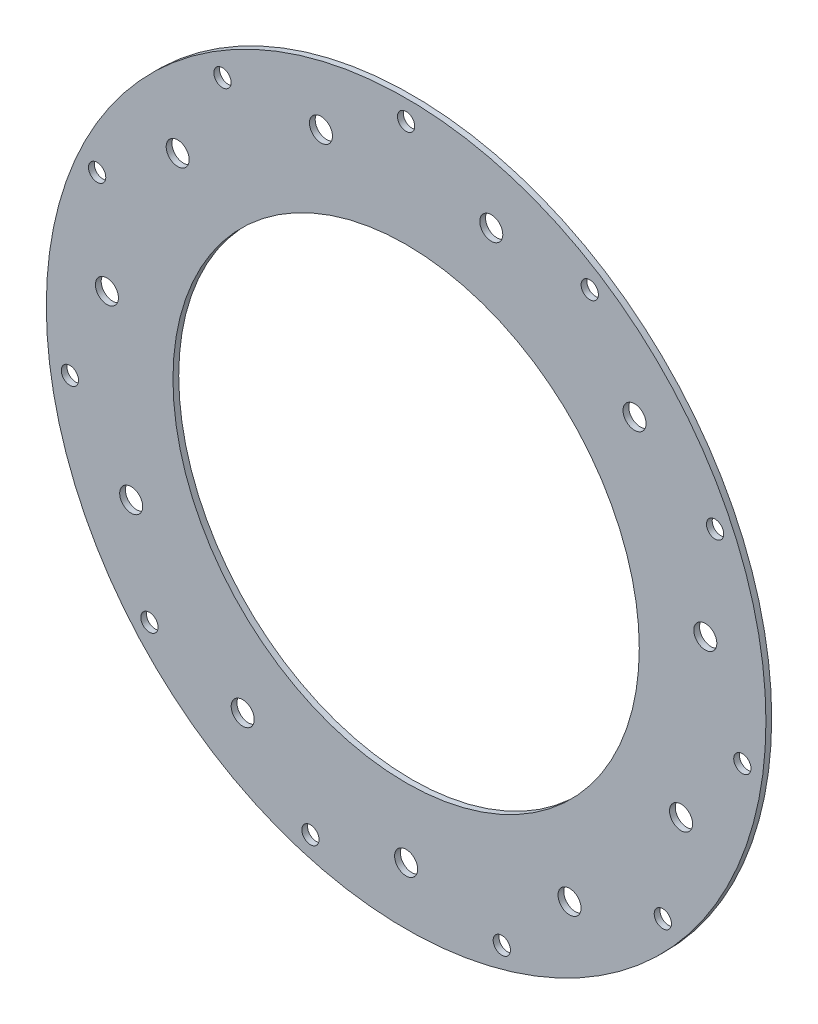
ISO-10303-21;
HEADER;
FILE_DESCRIPTION(('STEP AP214'),'2;1');
FILE_NAME('part.step','',(''),(''),'','','');
FILE_SCHEMA(('AUTOMOTIVE_DESIGN { 1 0 10303 214 1 1 1 1 }'));
ENDSEC;
DATA;
#1=APPLICATION_CONTEXT('core data for automotive mechanical design processes');
#2=APPLICATION_PROTOCOL_DEFINITION('international standard','automotive_design',2000,#1);
#3=PRODUCT_CONTEXT('',#1,'mechanical');
#4=PRODUCT('Part','Part','',(#3));
#5=PRODUCT_RELATED_PRODUCT_CATEGORY('part','',(#4));
#6=PRODUCT_DEFINITION_FORMATION('','',#4);
#7=PRODUCT_DEFINITION_CONTEXT('part definition',#1,'design');
#8=PRODUCT_DEFINITION('design','',#6,#7);
#9=PRODUCT_DEFINITION_SHAPE('','',#8);
#10=(LENGTH_UNIT() NAMED_UNIT(*) SI_UNIT(.MILLI.,.METRE.));
#11=(NAMED_UNIT(*) PLANE_ANGLE_UNIT() SI_UNIT($,.RADIAN.));
#12=(NAMED_UNIT(*) SI_UNIT($,.STERADIAN.) SOLID_ANGLE_UNIT());
#13=UNCERTAINTY_MEASURE_WITH_UNIT(LENGTH_MEASURE(1.E-05),#10,'distance_accuracy_value','');
#14=(GEOMETRIC_REPRESENTATION_CONTEXT(3) GLOBAL_UNCERTAINTY_ASSIGNED_CONTEXT((#13)) GLOBAL_UNIT_ASSIGNED_CONTEXT((#10,
#11,#12)) REPRESENTATION_CONTEXT('',''));
#15=CARTESIAN_POINT('',(0.,0.,0.));
#16=DIRECTION('',(0.,0.,1.));
#17=DIRECTION('',(1.,0.,0.));
#18=AXIS2_PLACEMENT_3D('',#15,#16,#17);
#19=CARTESIAN_POINT('',(0.,0.,1.));
#20=DIRECTION('',(0.,0.,1.));
#21=DIRECTION('',(1.,0.,0.));
#22=AXIS2_PLACEMENT_3D('',#19,#20,#21);
#23=PLANE('',#22);
#24=CARTESIAN_POINT('',(47.755679756112,-21.8092881825996,1.));
#25=DIRECTION('',(0.,0.,1.));
#26=DIRECTION('',(1.,0.,0.));
#27=AXIS2_PLACEMENT_3D('',#24,#25,#26);
#28=CIRCLE('',#27,2.);
#29=CARTESIAN_POINT('',(49.755679756112,-21.8092881825996,1.));
#30=VERTEX_POINT('',#29);
#31=EDGE_CURVE('E168',#30,#30,#28,.T.);
#32=ORIENTED_EDGE('',*,*,#31,.F.);
#33=EDGE_LOOP('',(#32));
#34=FACE_BOUND('',#33,.T.);
#35=CARTESIAN_POINT('',(39.6768526535989,34.3801885321271,1.));
#36=DIRECTION('',(0.,0.,1.));
#37=DIRECTION('',(1.,0.,0.));
#38=AXIS2_PLACEMENT_3D('',#35,#36,#37);
#39=CIRCLE('',#38,2.);
#40=CARTESIAN_POINT('',(41.6768526535989,34.3801885321271,1.));
#41=VERTEX_POINT('',#40);
#42=EDGE_CURVE('E156',#41,#41,#39,.T.);
#43=ORIENTED_EDGE('',*,*,#42,.F.);
#44=EDGE_LOOP('',(#43));
#45=FACE_BOUND('',#44,.T.);
#46=CARTESIAN_POINT('',(-14.7909592341747,50.3733811147612,1.));
#47=DIRECTION('',(0.,0.,1.));
#48=DIRECTION('',(1.,0.,0.));
#49=AXIS2_PLACEMENT_3D('',#46,#47,#48);
#50=CIRCLE('',#49,2.);
#51=CARTESIAN_POINT('',(-12.7909592341747,50.3733811147612,1.));
#52=VERTEX_POINT('',#51);
#53=EDGE_CURVE('E144',#52,#52,#50,.T.);
#54=ORIENTED_EDGE('',*,*,#53,.F.);
#55=EDGE_LOOP('',(#54));
#56=FACE_BOUND('',#55,.T.);
#57=CARTESIAN_POINT('',(-51.9656256987489,7.47152900934767,1.));
#58=DIRECTION('',(0.,0.,1.));
#59=DIRECTION('',(1.,0.,0.));
#60=AXIS2_PLACEMENT_3D('',#57,#58,#59);
#61=CIRCLE('',#60,2.);
#62=CARTESIAN_POINT('',(-49.9656256987489,7.47152900934767,1.));
#63=VERTEX_POINT('',#62);
#64=EDGE_CURVE('E132',#63,#63,#61,.T.);
#65=ORIENTED_EDGE('',*,*,#64,.F.);
#66=EDGE_LOOP('',(#65));
#67=FACE_BOUND('',#66,.T.);
#68=CARTESIAN_POINT('',(-28.3836429164189,-44.165810473637,1.));
#69=DIRECTION('',(0.,0.,1.));
#70=DIRECTION('',(1.,0.,0.));
#71=AXIS2_PLACEMENT_3D('',#68,#69,#70);
#72=CIRCLE('',#71,2.);
#73=CARTESIAN_POINT('',(-26.3836429164189,-44.165810473637,1.));
#74=VERTEX_POINT('',#73);
#75=EDGE_CURVE('E120',#74,#74,#72,.T.);
#76=ORIENTED_EDGE('',*,*,#75,.F.);
#77=EDGE_LOOP('',(#76));
#78=FACE_BOUND('',#77,.T.);
#79=CARTESIAN_POINT('',(44.5892248869008,-38.6367833027724,1.));
#80=DIRECTION('',(0.,0.,1.));
#81=DIRECTION('',(1.,0.,0.));
#82=AXIS2_PLACEMENT_3D('',#79,#80,#81);
#83=CIRCLE('',#82,1.5);
#84=CARTESIAN_POINT('',(46.0892248869008,-38.6367833027724,1.));
#85=VERTEX_POINT('',#84);
#86=EDGE_CURVE('E108',#85,#85,#83,.T.);
#87=ORIENTED_EDGE('',*,*,#86,.F.);
#88=EDGE_LOOP('',(#87));
#89=FACE_BOUND('',#88,.T.);
#90=CARTESIAN_POINT('',(53.6682877259168,24.5094857671108,1.));
#91=DIRECTION('',(0.,0.,1.));
#92=DIRECTION('',(1.,0.,0.));
#93=AXIS2_PLACEMENT_3D('',#90,#91,#92);
#94=CIRCLE('',#93,1.5);
#95=CARTESIAN_POINT('',(55.1682877259168,24.5094857671108,1.));
#96=VERTEX_POINT('',#95);
#97=EDGE_CURVE('E96',#96,#96,#94,.T.);
#98=ORIENTED_EDGE('',*,*,#97,.F.);
#99=EDGE_LOOP('',(#98));
#100=FACE_BOUND('',#99,.T.);
#101=CARTESIAN_POINT('',(4.30211422042248E-13,59.,1.));
#102=DIRECTION('',(0.,0.,1.));
#103=DIRECTION('',(1.,0.,0.));
#104=AXIS2_PLACEMENT_3D('',#101,#102,#103);
#105=CIRCLE('',#104,1.5);
#106=CARTESIAN_POINT('',(1.50000000000043,59.,1.));
#107=VERTEX_POINT('',#106);
#108=EDGE_CURVE('E84',#107,#107,#105,.T.);
#109=ORIENTED_EDGE('',*,*,#108,.F.);
#110=EDGE_LOOP('',(#109));
#111=FACE_BOUND('',#110,.T.);
#112=CARTESIAN_POINT('',(-53.6682877259165,24.5094857671115,1.));
#113=DIRECTION('',(0.,0.,1.));
#114=DIRECTION('',(1.,0.,0.));
#115=AXIS2_PLACEMENT_3D('',#112,#113,#114);
#116=CIRCLE('',#115,1.5);
#117=CARTESIAN_POINT('',(-52.1682877259165,24.5094857671115,1.));
#118=VERTEX_POINT('',#117);
#119=EDGE_CURVE('E72',#118,#118,#116,.T.);
#120=ORIENTED_EDGE('',*,*,#119,.F.);
#121=EDGE_LOOP('',(#120));
#122=FACE_BOUND('',#121,.T.);
#123=CARTESIAN_POINT('',(-44.5892248869013,-38.6367833027717,1.));
#124=DIRECTION('',(0.,0.,1.));
#125=DIRECTION('',(1.,0.,0.));
#126=AXIS2_PLACEMENT_3D('',#123,#124,#125);
#127=CIRCLE('',#126,1.5);
#128=CARTESIAN_POINT('',(-43.0892248869013,-38.6367833027717,1.));
#129=VERTEX_POINT('',#128);
#130=EDGE_CURVE('E60',#129,#129,#127,.T.);
#131=ORIENTED_EDGE('',*,*,#130,.F.);
#132=EDGE_LOOP('',(#131));
#133=FACE_BOUND('',#132,.T.);
#134=CARTESIAN_POINT('',(-16.6222208536444,-56.6100854432553,1.));
#135=DIRECTION('',(0.,0.,1.));
#136=DIRECTION('',(1.,0.,0.));
#137=AXIS2_PLACEMENT_3D('',#134,#135,#136);
#138=CIRCLE('',#137,1.5);
#139=CARTESIAN_POINT('',(-15.1222208536444,-56.6100854432553,1.));
#140=VERTEX_POINT('',#139);
#141=EDGE_CURVE('E48',#140,#140,#138,.T.);
#142=ORIENTED_EDGE('',*,*,#141,.F.);
#143=EDGE_LOOP('',(#142));
#144=FACE_BOUND('',#143,.T.);
#145=CARTESIAN_POINT('',(0.,0.,1.));
#146=DIRECTION('',(0.,0.,1.));
#147=DIRECTION('',(1.,0.,0.));
#148=AXIS2_PLACEMENT_3D('',#145,#146,#147);
#149=CIRCLE('',#148,62.5);
#150=CARTESIAN_POINT('',(62.5,0.,1.));
#151=VERTEX_POINT('',#150);
#152=EDGE_CURVE('E10',#151,#151,#149,.T.);
#153=ORIENTED_EDGE('',*,*,#152,.T.);
#154=EDGE_LOOP('',(#153));
#155=FACE_BOUND('',#154,.T.);
#156=CARTESIAN_POINT('',(0.,0.,1.));
#157=DIRECTION('',(0.,0.,1.));
#158=DIRECTION('',(1.,0.,0.));
#159=AXIS2_PLACEMENT_3D('',#156,#157,#158);
#160=CIRCLE('',#159,40.5);
#161=CARTESIAN_POINT('',(40.5,0.,1.));
#162=VERTEX_POINT('',#161);
#163=EDGE_CURVE('E43',#162,#162,#160,.T.);
#164=ORIENTED_EDGE('',*,*,#163,.F.);
#165=EDGE_LOOP('',(#164));
#166=FACE_BOUND('',#165,.T.);
#167=CARTESIAN_POINT('',(0.,-52.5,1.));
#168=DIRECTION('',(0.,0.,1.));
#169=DIRECTION('',(1.,0.,0.));
#170=AXIS2_PLACEMENT_3D('',#167,#168,#169);
#171=CIRCLE('',#170,2.);
#172=CARTESIAN_POINT('',(2.,-52.5,1.));
#173=VERTEX_POINT('',#172);
#174=EDGE_CURVE('E54',#173,#173,#171,.T.);
#175=ORIENTED_EDGE('',*,*,#174,.F.);
#176=EDGE_LOOP('',(#175));
#177=FACE_BOUND('',#176,.T.);
#178=CARTESIAN_POINT('',(-58.3994650709751,-8.39657545812364,1.));
#179=DIRECTION('',(0.,0.,1.));
#180=DIRECTION('',(1.,0.,0.));
#181=AXIS2_PLACEMENT_3D('',#178,#179,#180);
#182=CIRCLE('',#181,1.50000000000001);
#183=CARTESIAN_POINT('',(-56.8994650709751,-8.39657545812364,1.));
#184=VERTEX_POINT('',#183);
#185=EDGE_CURVE('E66',#184,#184,#182,.T.);
#186=ORIENTED_EDGE('',*,*,#185,.F.);
#187=EDGE_LOOP('',(#186));
#188=FACE_BOUND('',#187,.T.);
#189=CARTESIAN_POINT('',(-31.89780822988,49.6339584370399,1.));
#190=DIRECTION('',(0.,0.,1.));
#191=DIRECTION('',(1.,0.,0.));
#192=AXIS2_PLACEMENT_3D('',#189,#190,#191);
#193=CIRCLE('',#192,1.5);
#194=CARTESIAN_POINT('',(-30.3978082298799,49.6339584370399,1.));
#195=VERTEX_POINT('',#194);
#196=EDGE_CURVE('E78',#195,#195,#193,.T.);
#197=ORIENTED_EDGE('',*,*,#196,.F.);
#198=EDGE_LOOP('',(#197));
#199=FACE_BOUND('',#198,.T.);
#200=CARTESIAN_POINT('',(31.8978082298807,49.6339584370394,1.));
#201=DIRECTION('',(0.,0.,1.));
#202=DIRECTION('',(1.,0.,0.));
#203=AXIS2_PLACEMENT_3D('',#200,#201,#202);
#204=CIRCLE('',#203,1.5);
#205=CARTESIAN_POINT('',(33.3978082298807,49.6339584370394,1.));
#206=VERTEX_POINT('',#205);
#207=EDGE_CURVE('E90',#206,#206,#204,.T.);
#208=ORIENTED_EDGE('',*,*,#207,.F.);
#209=EDGE_LOOP('',(#208));
#210=FACE_BOUND('',#209,.T.);
#211=CARTESIAN_POINT('',(58.3994650709749,-8.39657545812446,1.));
#212=DIRECTION('',(0.,0.,1.));
#213=DIRECTION('',(1.,0.,0.));
#214=AXIS2_PLACEMENT_3D('',#211,#212,#213);
#215=CIRCLE('',#214,1.5);
#216=CARTESIAN_POINT('',(59.8994650709749,-8.39657545812446,1.));
#217=VERTEX_POINT('',#216);
#218=EDGE_CURVE('E102',#217,#217,#215,.T.);
#219=ORIENTED_EDGE('',*,*,#218,.F.);
#220=EDGE_LOOP('',(#219));
#221=FACE_BOUND('',#220,.T.);
#222=CARTESIAN_POINT('',(16.6222208536436,-56.6100854432556,1.));
#223=DIRECTION('',(0.,0.,1.));
#224=DIRECTION('',(1.,0.,0.));
#225=AXIS2_PLACEMENT_3D('',#222,#223,#224);
#226=CIRCLE('',#225,1.50000000000001);
#227=CARTESIAN_POINT('',(18.1222208536436,-56.6100854432556,1.));
#228=VERTEX_POINT('',#227);
#229=EDGE_CURVE('E114',#228,#228,#226,.T.);
#230=ORIENTED_EDGE('',*,*,#229,.F.);
#231=EDGE_LOOP('',(#230));
#232=FACE_BOUND('',#231,.T.);
#233=CARTESIAN_POINT('',(-47.7556797561123,-21.8092881825989,1.));
#234=DIRECTION('',(0.,0.,1.));
#235=DIRECTION('',(1.,0.,0.));
#236=AXIS2_PLACEMENT_3D('',#233,#234,#235);
#237=CIRCLE('',#236,2.);
#238=CARTESIAN_POINT('',(-45.7556797561123,-21.8092881825989,1.));
#239=VERTEX_POINT('',#238);
#240=EDGE_CURVE('E126',#239,#239,#237,.T.);
#241=ORIENTED_EDGE('',*,*,#240,.F.);
#242=EDGE_LOOP('',(#241));
#243=FACE_BOUND('',#242,.T.);
#244=CARTESIAN_POINT('',(-39.6768526535984,34.3801885321277,1.));
#245=DIRECTION('',(0.,0.,1.));
#246=DIRECTION('',(1.,0.,0.));
#247=AXIS2_PLACEMENT_3D('',#244,#245,#246);
#248=CIRCLE('',#247,2.);
#249=CARTESIAN_POINT('',(-37.6768526535984,34.3801885321277,1.));
#250=VERTEX_POINT('',#249);
#251=EDGE_CURVE('E138',#250,#250,#248,.T.);
#252=ORIENTED_EDGE('',*,*,#251,.F.);
#253=EDGE_LOOP('',(#252));
#254=FACE_BOUND('',#253,.T.);
#255=CARTESIAN_POINT('',(14.7909592341754,50.373381114761,1.));
#256=DIRECTION('',(0.,0.,1.));
#257=DIRECTION('',(1.,0.,0.));
#258=AXIS2_PLACEMENT_3D('',#255,#256,#257);
#259=CIRCLE('',#258,2.);
#260=CARTESIAN_POINT('',(16.7909592341754,50.373381114761,1.));
#261=VERTEX_POINT('',#260);
#262=EDGE_CURVE('E150',#261,#261,#259,.T.);
#263=ORIENTED_EDGE('',*,*,#262,.F.);
#264=EDGE_LOOP('',(#263));
#265=FACE_BOUND('',#264,.T.);
#266=CARTESIAN_POINT('',(51.965625698749,7.47152900934692,1.));
#267=DIRECTION('',(0.,0.,1.));
#268=DIRECTION('',(1.,0.,0.));
#269=AXIS2_PLACEMENT_3D('',#266,#267,#268);
#270=CIRCLE('',#269,2.);
#271=CARTESIAN_POINT('',(53.965625698749,7.47152900934692,1.));
#272=VERTEX_POINT('',#271);
#273=EDGE_CURVE('E162',#272,#272,#270,.T.);
#274=ORIENTED_EDGE('',*,*,#273,.F.);
#275=EDGE_LOOP('',(#274));
#276=FACE_BOUND('',#275,.T.);
#277=CARTESIAN_POINT('',(28.3836429164183,-44.1658104736374,1.));
#278=DIRECTION('',(0.,0.,1.));
#279=DIRECTION('',(1.,0.,0.));
#280=AXIS2_PLACEMENT_3D('',#277,#278,#279);
#281=CIRCLE('',#280,1.99999999999999);
#282=CARTESIAN_POINT('',(30.3836429164183,-44.1658104736374,1.));
#283=VERTEX_POINT('',#282);
#284=EDGE_CURVE('E174',#283,#283,#281,.T.);
#285=ORIENTED_EDGE('',*,*,#284,.F.);
#286=EDGE_LOOP('',(#285));
#287=FACE_BOUND('',#286,.T.);
#288=ADVANCED_FACE('F32',(#34,#45,#56,#67,#78,#89,#100,#111,#122,#133,#144,#155,#166,#177,#188,
#199,#210,#221,#232,#243,#254,#265,#276,#287),#23,.T.);
#289=CARTESIAN_POINT('',(0.,0.,0.));
#290=DIRECTION('',(0.,0.,1.));
#291=DIRECTION('',(1.,0.,0.));
#292=AXIS2_PLACEMENT_3D('',#289,#290,#291);
#293=PLANE('',#292);
#294=CARTESIAN_POINT('',(0.,0.,0.));
#295=DIRECTION('',(0.,0.,1.));
#296=DIRECTION('',(1.,0.,0.));
#297=AXIS2_PLACEMENT_3D('',#294,#295,#296);
#298=CIRCLE('',#297,62.5);
#299=CARTESIAN_POINT('',(62.5,0.,0.));
#300=VERTEX_POINT('',#299);
#301=EDGE_CURVE('E36',#300,#300,#298,.T.);
#302=ORIENTED_EDGE('',*,*,#301,.F.);
#303=EDGE_LOOP('',(#302));
#304=FACE_BOUND('',#303,.T.);
#305=CARTESIAN_POINT('',(0.,0.,0.));
#306=DIRECTION('',(0.,0.,1.));
#307=DIRECTION('',(1.,0.,0.));
#308=AXIS2_PLACEMENT_3D('',#305,#306,#307);
#309=CIRCLE('',#308,40.5);
#310=CARTESIAN_POINT('',(40.5,0.,0.));
#311=VERTEX_POINT('',#310);
#312=EDGE_CURVE('E45',#311,#311,#309,.T.);
#313=ORIENTED_EDGE('',*,*,#312,.T.);
#314=EDGE_LOOP('',(#313));
#315=FACE_BOUND('',#314,.T.);
#316=CARTESIAN_POINT('',(-16.6222208536444,-56.6100854432553,0.));
#317=DIRECTION('',(0.,0.,1.));
#318=DIRECTION('',(1.,0.,0.));
#319=AXIS2_PLACEMENT_3D('',#316,#317,#318);
#320=CIRCLE('',#319,1.5);
#321=CARTESIAN_POINT('',(-15.1222208536444,-56.6100854432553,0.));
#322=VERTEX_POINT('',#321);
#323=EDGE_CURVE('E51',#322,#322,#320,.T.);
#324=ORIENTED_EDGE('',*,*,#323,.T.);
#325=EDGE_LOOP('',(#324));
#326=FACE_BOUND('',#325,.T.);
#327=CARTESIAN_POINT('',(0.,-52.5,0.));
#328=DIRECTION('',(0.,0.,1.));
#329=DIRECTION('',(1.,0.,0.));
#330=AXIS2_PLACEMENT_3D('',#327,#328,#329);
#331=CIRCLE('',#330,2.);
#332=CARTESIAN_POINT('',(2.,-52.5,0.));
#333=VERTEX_POINT('',#332);
#334=EDGE_CURVE('E57',#333,#333,#331,.T.);
#335=ORIENTED_EDGE('',*,*,#334,.T.);
#336=EDGE_LOOP('',(#335));
#337=FACE_BOUND('',#336,.T.);
#338=CARTESIAN_POINT('',(-44.5892248869013,-38.6367833027717,0.));
#339=DIRECTION('',(0.,0.,1.));
#340=DIRECTION('',(1.,0.,0.));
#341=AXIS2_PLACEMENT_3D('',#338,#339,#340);
#342=CIRCLE('',#341,1.5);
#343=CARTESIAN_POINT('',(-43.0892248869013,-38.6367833027717,0.));
#344=VERTEX_POINT('',#343);
#345=EDGE_CURVE('E63',#344,#344,#342,.T.);
#346=ORIENTED_EDGE('',*,*,#345,.T.);
#347=EDGE_LOOP('',(#346));
#348=FACE_BOUND('',#347,.T.);
#349=CARTESIAN_POINT('',(-58.3994650709751,-8.39657545812364,0.));
#350=DIRECTION('',(0.,0.,1.));
#351=DIRECTION('',(1.,0.,0.));
#352=AXIS2_PLACEMENT_3D('',#349,#350,#351);
#353=CIRCLE('',#352,1.50000000000001);
#354=CARTESIAN_POINT('',(-56.8994650709751,-8.39657545812364,0.));
#355=VERTEX_POINT('',#354);
#356=EDGE_CURVE('E69',#355,#355,#353,.T.);
#357=ORIENTED_EDGE('',*,*,#356,.T.);
#358=EDGE_LOOP('',(#357));
#359=FACE_BOUND('',#358,.T.);
#360=CARTESIAN_POINT('',(-53.6682877259165,24.5094857671115,0.));
#361=DIRECTION('',(0.,0.,1.));
#362=DIRECTION('',(1.,0.,0.));
#363=AXIS2_PLACEMENT_3D('',#360,#361,#362);
#364=CIRCLE('',#363,1.5);
#365=CARTESIAN_POINT('',(-52.1682877259165,24.5094857671115,0.));
#366=VERTEX_POINT('',#365);
#367=EDGE_CURVE('E75',#366,#366,#364,.T.);
#368=ORIENTED_EDGE('',*,*,#367,.T.);
#369=EDGE_LOOP('',(#368));
#370=FACE_BOUND('',#369,.T.);
#371=CARTESIAN_POINT('',(-31.89780822988,49.6339584370399,0.));
#372=DIRECTION('',(0.,0.,1.));
#373=DIRECTION('',(1.,0.,0.));
#374=AXIS2_PLACEMENT_3D('',#371,#372,#373);
#375=CIRCLE('',#374,1.5);
#376=CARTESIAN_POINT('',(-30.3978082298799,49.6339584370399,0.));
#377=VERTEX_POINT('',#376);
#378=EDGE_CURVE('E81',#377,#377,#375,.T.);
#379=ORIENTED_EDGE('',*,*,#378,.T.);
#380=EDGE_LOOP('',(#379));
#381=FACE_BOUND('',#380,.T.);
#382=CARTESIAN_POINT('',(4.30211422042248E-13,59.,0.));
#383=DIRECTION('',(0.,0.,1.));
#384=DIRECTION('',(1.,0.,0.));
#385=AXIS2_PLACEMENT_3D('',#382,#383,#384);
#386=CIRCLE('',#385,1.5);
#387=CARTESIAN_POINT('',(1.50000000000043,59.,0.));
#388=VERTEX_POINT('',#387);
#389=EDGE_CURVE('E87',#388,#388,#386,.T.);
#390=ORIENTED_EDGE('',*,*,#389,.T.);
#391=EDGE_LOOP('',(#390));
#392=FACE_BOUND('',#391,.T.);
#393=CARTESIAN_POINT('',(31.8978082298807,49.6339584370394,0.));
#394=DIRECTION('',(0.,0.,1.));
#395=DIRECTION('',(1.,0.,0.));
#396=AXIS2_PLACEMENT_3D('',#393,#394,#395);
#397=CIRCLE('',#396,1.5);
#398=CARTESIAN_POINT('',(33.3978082298807,49.6339584370394,0.));
#399=VERTEX_POINT('',#398);
#400=EDGE_CURVE('E93',#399,#399,#397,.T.);
#401=ORIENTED_EDGE('',*,*,#400,.T.);
#402=EDGE_LOOP('',(#401));
#403=FACE_BOUND('',#402,.T.);
#404=CARTESIAN_POINT('',(53.6682877259168,24.5094857671108,0.));
#405=DIRECTION('',(0.,0.,1.));
#406=DIRECTION('',(1.,0.,0.));
#407=AXIS2_PLACEMENT_3D('',#404,#405,#406);
#408=CIRCLE('',#407,1.5);
#409=CARTESIAN_POINT('',(55.1682877259168,24.5094857671108,0.));
#410=VERTEX_POINT('',#409);
#411=EDGE_CURVE('E99',#410,#410,#408,.T.);
#412=ORIENTED_EDGE('',*,*,#411,.T.);
#413=EDGE_LOOP('',(#412));
#414=FACE_BOUND('',#413,.T.);
#415=CARTESIAN_POINT('',(58.3994650709749,-8.39657545812446,0.));
#416=DIRECTION('',(0.,0.,1.));
#417=DIRECTION('',(1.,0.,0.));
#418=AXIS2_PLACEMENT_3D('',#415,#416,#417);
#419=CIRCLE('',#418,1.5);
#420=CARTESIAN_POINT('',(59.8994650709749,-8.39657545812446,0.));
#421=VERTEX_POINT('',#420);
#422=EDGE_CURVE('E105',#421,#421,#419,.T.);
#423=ORIENTED_EDGE('',*,*,#422,.T.);
#424=EDGE_LOOP('',(#423));
#425=FACE_BOUND('',#424,.T.);
#426=CARTESIAN_POINT('',(44.5892248869008,-38.6367833027724,0.));
#427=DIRECTION('',(0.,0.,1.));
#428=DIRECTION('',(1.,0.,0.));
#429=AXIS2_PLACEMENT_3D('',#426,#427,#428);
#430=CIRCLE('',#429,1.5);
#431=CARTESIAN_POINT('',(46.0892248869008,-38.6367833027724,0.));
#432=VERTEX_POINT('',#431);
#433=EDGE_CURVE('E111',#432,#432,#430,.T.);
#434=ORIENTED_EDGE('',*,*,#433,.T.);
#435=EDGE_LOOP('',(#434));
#436=FACE_BOUND('',#435,.T.);
#437=CARTESIAN_POINT('',(16.6222208536436,-56.6100854432556,0.));
#438=DIRECTION('',(0.,0.,1.));
#439=DIRECTION('',(1.,0.,0.));
#440=AXIS2_PLACEMENT_3D('',#437,#438,#439);
#441=CIRCLE('',#440,1.50000000000001);
#442=CARTESIAN_POINT('',(18.1222208536436,-56.6100854432556,0.));
#443=VERTEX_POINT('',#442);
#444=EDGE_CURVE('E117',#443,#443,#441,.T.);
#445=ORIENTED_EDGE('',*,*,#444,.T.);
#446=EDGE_LOOP('',(#445));
#447=FACE_BOUND('',#446,.T.);
#448=CARTESIAN_POINT('',(-28.3836429164189,-44.165810473637,0.));
#449=DIRECTION('',(0.,0.,1.));
#450=DIRECTION('',(1.,0.,0.));
#451=AXIS2_PLACEMENT_3D('',#448,#449,#450);
#452=CIRCLE('',#451,2.);
#453=CARTESIAN_POINT('',(-26.3836429164189,-44.165810473637,0.));
#454=VERTEX_POINT('',#453);
#455=EDGE_CURVE('E123',#454,#454,#452,.T.);
#456=ORIENTED_EDGE('',*,*,#455,.T.);
#457=EDGE_LOOP('',(#456));
#458=FACE_BOUND('',#457,.T.);
#459=CARTESIAN_POINT('',(-47.7556797561123,-21.8092881825989,0.));
#460=DIRECTION('',(0.,0.,1.));
#461=DIRECTION('',(1.,0.,0.));
#462=AXIS2_PLACEMENT_3D('',#459,#460,#461);
#463=CIRCLE('',#462,2.);
#464=CARTESIAN_POINT('',(-45.7556797561123,-21.8092881825989,0.));
#465=VERTEX_POINT('',#464);
#466=EDGE_CURVE('E129',#465,#465,#463,.T.);
#467=ORIENTED_EDGE('',*,*,#466,.T.);
#468=EDGE_LOOP('',(#467));
#469=FACE_BOUND('',#468,.T.);
#470=CARTESIAN_POINT('',(-51.9656256987489,7.47152900934767,0.));
#471=DIRECTION('',(0.,0.,1.));
#472=DIRECTION('',(1.,0.,0.));
#473=AXIS2_PLACEMENT_3D('',#470,#471,#472);
#474=CIRCLE('',#473,2.);
#475=CARTESIAN_POINT('',(-49.9656256987489,7.47152900934767,0.));
#476=VERTEX_POINT('',#475);
#477=EDGE_CURVE('E135',#476,#476,#474,.T.);
#478=ORIENTED_EDGE('',*,*,#477,.T.);
#479=EDGE_LOOP('',(#478));
#480=FACE_BOUND('',#479,.T.);
#481=CARTESIAN_POINT('',(-39.6768526535984,34.3801885321277,0.));
#482=DIRECTION('',(0.,0.,1.));
#483=DIRECTION('',(1.,0.,0.));
#484=AXIS2_PLACEMENT_3D('',#481,#482,#483);
#485=CIRCLE('',#484,2.);
#486=CARTESIAN_POINT('',(-37.6768526535984,34.3801885321277,0.));
#487=VERTEX_POINT('',#486);
#488=EDGE_CURVE('E141',#487,#487,#485,.T.);
#489=ORIENTED_EDGE('',*,*,#488,.T.);
#490=EDGE_LOOP('',(#489));
#491=FACE_BOUND('',#490,.T.);
#492=CARTESIAN_POINT('',(-14.7909592341747,50.3733811147612,0.));
#493=DIRECTION('',(0.,0.,1.));
#494=DIRECTION('',(1.,0.,0.));
#495=AXIS2_PLACEMENT_3D('',#492,#493,#494);
#496=CIRCLE('',#495,2.);
#497=CARTESIAN_POINT('',(-12.7909592341747,50.3733811147612,0.));
#498=VERTEX_POINT('',#497);
#499=EDGE_CURVE('E147',#498,#498,#496,.T.);
#500=ORIENTED_EDGE('',*,*,#499,.T.);
#501=EDGE_LOOP('',(#500));
#502=FACE_BOUND('',#501,.T.);
#503=CARTESIAN_POINT('',(14.7909592341754,50.373381114761,0.));
#504=DIRECTION('',(0.,0.,1.));
#505=DIRECTION('',(1.,0.,0.));
#506=AXIS2_PLACEMENT_3D('',#503,#504,#505);
#507=CIRCLE('',#506,2.);
#508=CARTESIAN_POINT('',(16.7909592341754,50.373381114761,0.));
#509=VERTEX_POINT('',#508);
#510=EDGE_CURVE('E153',#509,#509,#507,.T.);
#511=ORIENTED_EDGE('',*,*,#510,.T.);
#512=EDGE_LOOP('',(#511));
#513=FACE_BOUND('',#512,.T.);
#514=CARTESIAN_POINT('',(39.6768526535989,34.3801885321271,0.));
#515=DIRECTION('',(0.,0.,1.));
#516=DIRECTION('',(1.,0.,0.));
#517=AXIS2_PLACEMENT_3D('',#514,#515,#516);
#518=CIRCLE('',#517,2.);
#519=CARTESIAN_POINT('',(41.6768526535989,34.3801885321271,0.));
#520=VERTEX_POINT('',#519);
#521=EDGE_CURVE('E159',#520,#520,#518,.T.);
#522=ORIENTED_EDGE('',*,*,#521,.T.);
#523=EDGE_LOOP('',(#522));
#524=FACE_BOUND('',#523,.T.);
#525=CARTESIAN_POINT('',(51.965625698749,7.47152900934692,0.));
#526=DIRECTION('',(0.,0.,1.));
#527=DIRECTION('',(1.,0.,0.));
#528=AXIS2_PLACEMENT_3D('',#525,#526,#527);
#529=CIRCLE('',#528,2.);
#530=CARTESIAN_POINT('',(53.965625698749,7.47152900934692,0.));
#531=VERTEX_POINT('',#530);
#532=EDGE_CURVE('E165',#531,#531,#529,.T.);
#533=ORIENTED_EDGE('',*,*,#532,.T.);
#534=EDGE_LOOP('',(#533));
#535=FACE_BOUND('',#534,.T.);
#536=CARTESIAN_POINT('',(47.755679756112,-21.8092881825996,0.));
#537=DIRECTION('',(0.,0.,1.));
#538=DIRECTION('',(1.,0.,0.));
#539=AXIS2_PLACEMENT_3D('',#536,#537,#538);
#540=CIRCLE('',#539,2.);
#541=CARTESIAN_POINT('',(49.755679756112,-21.8092881825996,0.));
#542=VERTEX_POINT('',#541);
#543=EDGE_CURVE('E171',#542,#542,#540,.T.);
#544=ORIENTED_EDGE('',*,*,#543,.T.);
#545=EDGE_LOOP('',(#544));
#546=FACE_BOUND('',#545,.T.);
#547=CARTESIAN_POINT('',(28.3836429164183,-44.1658104736374,0.));
#548=DIRECTION('',(0.,0.,1.));
#549=DIRECTION('',(1.,0.,0.));
#550=AXIS2_PLACEMENT_3D('',#547,#548,#549);
#551=CIRCLE('',#550,1.99999999999999);
#552=CARTESIAN_POINT('',(30.3836429164183,-44.1658104736374,0.));
#553=VERTEX_POINT('',#552);
#554=EDGE_CURVE('E177',#553,#553,#551,.T.);
#555=ORIENTED_EDGE('',*,*,#554,.T.);
#556=EDGE_LOOP('',(#555));
#557=FACE_BOUND('',#556,.T.);
#558=ADVANCED_FACE('F187',(#304,#315,#326,#337,#348,#359,#370,#381,#392,#403,#414,#425,#436,
#447,#458,#469,#480,#491,#502,#513,#524,#535,#546,#557),#293,.F.);
#559=CARTESIAN_POINT('',(0.,0.,1.));
#560=DIRECTION('',(0.,0.,-1.));
#561=DIRECTION('',(-1.,0.,0.));
#562=AXIS2_PLACEMENT_3D('',#559,#560,#561);
#563=CYLINDRICAL_SURFACE('',#562,62.5);
#564=ORIENTED_EDGE('',*,*,#152,.F.);
#565=EDGE_LOOP('',(#564));
#566=FACE_BOUND('',#565,.T.);
#567=ORIENTED_EDGE('',*,*,#301,.T.);
#568=EDGE_LOOP('',(#567));
#569=FACE_BOUND('',#568,.T.);
#570=ADVANCED_FACE('F34',(#566,#569),#563,.T.);
#571=CARTESIAN_POINT('',(0.,0.,1.));
#572=DIRECTION('',(0.,0.,-1.));
#573=DIRECTION('',(-1.,0.,0.));
#574=AXIS2_PLACEMENT_3D('',#571,#572,#573);
#575=CYLINDRICAL_SURFACE('',#574,40.5);
#576=ORIENTED_EDGE('',*,*,#163,.T.);
#577=EDGE_LOOP('',(#576));
#578=FACE_BOUND('',#577,.T.);
#579=ORIENTED_EDGE('',*,*,#312,.F.);
#580=EDGE_LOOP('',(#579));
#581=FACE_BOUND('',#580,.T.);
#582=ADVANCED_FACE('F197',(#578,#581),#575,.F.);
#583=CARTESIAN_POINT('',(-16.6222208536444,-56.6100854432553,1.));
#584=DIRECTION('',(0.,0.,-1.));
#585=DIRECTION('',(-1.,0.,0.));
#586=AXIS2_PLACEMENT_3D('',#583,#584,#585);
#587=CYLINDRICAL_SURFACE('',#586,1.5);
#588=ORIENTED_EDGE('',*,*,#141,.T.);
#589=EDGE_LOOP('',(#588));
#590=FACE_BOUND('',#589,.T.);
#591=ORIENTED_EDGE('',*,*,#323,.F.);
#592=EDGE_LOOP('',(#591));
#593=FACE_BOUND('',#592,.T.);
#594=ADVANCED_FACE('F200',(#590,#593),#587,.F.);
#595=CARTESIAN_POINT('',(0.,-52.5,1.));
#596=DIRECTION('',(0.,0.,-1.));
#597=DIRECTION('',(-1.,0.,0.));
#598=AXIS2_PLACEMENT_3D('',#595,#596,#597);
#599=CYLINDRICAL_SURFACE('',#598,2.);
#600=ORIENTED_EDGE('',*,*,#174,.T.);
#601=EDGE_LOOP('',(#600));
#602=FACE_BOUND('',#601,.T.);
#603=ORIENTED_EDGE('',*,*,#334,.F.);
#604=EDGE_LOOP('',(#603));
#605=FACE_BOUND('',#604,.T.);
#606=ADVANCED_FACE('F204',(#602,#605),#599,.F.);
#607=CARTESIAN_POINT('',(-44.5892248869013,-38.6367833027717,1.));
#608=DIRECTION('',(0.,0.,-1.));
#609=DIRECTION('',(-1.,0.,0.));
#610=AXIS2_PLACEMENT_3D('',#607,#608,#609);
#611=CYLINDRICAL_SURFACE('',#610,1.5);
#612=ORIENTED_EDGE('',*,*,#130,.T.);
#613=EDGE_LOOP('',(#612));
#614=FACE_BOUND('',#613,.T.);
#615=ORIENTED_EDGE('',*,*,#345,.F.);
#616=EDGE_LOOP('',(#615));
#617=FACE_BOUND('',#616,.T.);
#618=ADVANCED_FACE('F208',(#614,#617),#611,.F.);
#619=CARTESIAN_POINT('',(-58.3994650709751,-8.39657545812364,1.));
#620=DIRECTION('',(0.,0.,-1.));
#621=DIRECTION('',(-1.,0.,0.));
#622=AXIS2_PLACEMENT_3D('',#619,#620,#621);
#623=CYLINDRICAL_SURFACE('',#622,1.50000000000001);
#624=ORIENTED_EDGE('',*,*,#185,.T.);
#625=EDGE_LOOP('',(#624));
#626=FACE_BOUND('',#625,.T.);
#627=ORIENTED_EDGE('',*,*,#356,.F.);
#628=EDGE_LOOP('',(#627));
#629=FACE_BOUND('',#628,.T.);
#630=ADVANCED_FACE('F212',(#626,#629),#623,.F.);
#631=CARTESIAN_POINT('',(-53.6682877259165,24.5094857671115,1.));
#632=DIRECTION('',(0.,0.,-1.));
#633=DIRECTION('',(-1.,0.,0.));
#634=AXIS2_PLACEMENT_3D('',#631,#632,#633);
#635=CYLINDRICAL_SURFACE('',#634,1.5);
#636=ORIENTED_EDGE('',*,*,#119,.T.);
#637=EDGE_LOOP('',(#636));
#638=FACE_BOUND('',#637,.T.);
#639=ORIENTED_EDGE('',*,*,#367,.F.);
#640=EDGE_LOOP('',(#639));
#641=FACE_BOUND('',#640,.T.);
#642=ADVANCED_FACE('F216',(#638,#641),#635,.F.);
#643=CARTESIAN_POINT('',(-31.89780822988,49.6339584370399,1.));
#644=DIRECTION('',(0.,0.,-1.));
#645=DIRECTION('',(-1.,0.,0.));
#646=AXIS2_PLACEMENT_3D('',#643,#644,#645);
#647=CYLINDRICAL_SURFACE('',#646,1.5);
#648=ORIENTED_EDGE('',*,*,#196,.T.);
#649=EDGE_LOOP('',(#648));
#650=FACE_BOUND('',#649,.T.);
#651=ORIENTED_EDGE('',*,*,#378,.F.);
#652=EDGE_LOOP('',(#651));
#653=FACE_BOUND('',#652,.T.);
#654=ADVANCED_FACE('F220',(#650,#653),#647,.F.);
#655=CARTESIAN_POINT('',(4.30211422042248E-13,59.,1.));
#656=DIRECTION('',(0.,0.,-1.));
#657=DIRECTION('',(-1.,0.,0.));
#658=AXIS2_PLACEMENT_3D('',#655,#656,#657);
#659=CYLINDRICAL_SURFACE('',#658,1.5);
#660=ORIENTED_EDGE('',*,*,#108,.T.);
#661=EDGE_LOOP('',(#660));
#662=FACE_BOUND('',#661,.T.);
#663=ORIENTED_EDGE('',*,*,#389,.F.);
#664=EDGE_LOOP('',(#663));
#665=FACE_BOUND('',#664,.T.);
#666=ADVANCED_FACE('F224',(#662,#665),#659,.F.);
#667=CARTESIAN_POINT('',(31.8978082298807,49.6339584370394,1.));
#668=DIRECTION('',(0.,0.,-1.));
#669=DIRECTION('',(-1.,0.,0.));
#670=AXIS2_PLACEMENT_3D('',#667,#668,#669);
#671=CYLINDRICAL_SURFACE('',#670,1.5);
#672=ORIENTED_EDGE('',*,*,#207,.T.);
#673=EDGE_LOOP('',(#672));
#674=FACE_BOUND('',#673,.T.);
#675=ORIENTED_EDGE('',*,*,#400,.F.);
#676=EDGE_LOOP('',(#675));
#677=FACE_BOUND('',#676,.T.);
#678=ADVANCED_FACE('F228',(#674,#677),#671,.F.);
#679=CARTESIAN_POINT('',(53.6682877259168,24.5094857671108,1.));
#680=DIRECTION('',(0.,0.,-1.));
#681=DIRECTION('',(-1.,0.,0.));
#682=AXIS2_PLACEMENT_3D('',#679,#680,#681);
#683=CYLINDRICAL_SURFACE('',#682,1.5);
#684=ORIENTED_EDGE('',*,*,#97,.T.);
#685=EDGE_LOOP('',(#684));
#686=FACE_BOUND('',#685,.T.);
#687=ORIENTED_EDGE('',*,*,#411,.F.);
#688=EDGE_LOOP('',(#687));
#689=FACE_BOUND('',#688,.T.);
#690=ADVANCED_FACE('F232',(#686,#689),#683,.F.);
#691=CARTESIAN_POINT('',(58.3994650709749,-8.39657545812446,1.));
#692=DIRECTION('',(0.,0.,-1.));
#693=DIRECTION('',(-1.,0.,0.));
#694=AXIS2_PLACEMENT_3D('',#691,#692,#693);
#695=CYLINDRICAL_SURFACE('',#694,1.5);
#696=ORIENTED_EDGE('',*,*,#218,.T.);
#697=EDGE_LOOP('',(#696));
#698=FACE_BOUND('',#697,.T.);
#699=ORIENTED_EDGE('',*,*,#422,.F.);
#700=EDGE_LOOP('',(#699));
#701=FACE_BOUND('',#700,.T.);
#702=ADVANCED_FACE('F236',(#698,#701),#695,.F.);
#703=CARTESIAN_POINT('',(44.5892248869008,-38.6367833027724,1.));
#704=DIRECTION('',(0.,0.,-1.));
#705=DIRECTION('',(-1.,0.,0.));
#706=AXIS2_PLACEMENT_3D('',#703,#704,#705);
#707=CYLINDRICAL_SURFACE('',#706,1.5);
#708=ORIENTED_EDGE('',*,*,#86,.T.);
#709=EDGE_LOOP('',(#708));
#710=FACE_BOUND('',#709,.T.);
#711=ORIENTED_EDGE('',*,*,#433,.F.);
#712=EDGE_LOOP('',(#711));
#713=FACE_BOUND('',#712,.T.);
#714=ADVANCED_FACE('F240',(#710,#713),#707,.F.);
#715=CARTESIAN_POINT('',(16.6222208536436,-56.6100854432556,1.));
#716=DIRECTION('',(0.,0.,-1.));
#717=DIRECTION('',(-1.,0.,0.));
#718=AXIS2_PLACEMENT_3D('',#715,#716,#717);
#719=CYLINDRICAL_SURFACE('',#718,1.50000000000001);
#720=ORIENTED_EDGE('',*,*,#229,.T.);
#721=EDGE_LOOP('',(#720));
#722=FACE_BOUND('',#721,.T.);
#723=ORIENTED_EDGE('',*,*,#444,.F.);
#724=EDGE_LOOP('',(#723));
#725=FACE_BOUND('',#724,.T.);
#726=ADVANCED_FACE('F244',(#722,#725),#719,.F.);
#727=CARTESIAN_POINT('',(-28.3836429164189,-44.165810473637,1.));
#728=DIRECTION('',(0.,0.,-1.));
#729=DIRECTION('',(-1.,0.,0.));
#730=AXIS2_PLACEMENT_3D('',#727,#728,#729);
#731=CYLINDRICAL_SURFACE('',#730,2.);
#732=ORIENTED_EDGE('',*,*,#75,.T.);
#733=EDGE_LOOP('',(#732));
#734=FACE_BOUND('',#733,.T.);
#735=ORIENTED_EDGE('',*,*,#455,.F.);
#736=EDGE_LOOP('',(#735));
#737=FACE_BOUND('',#736,.T.);
#738=ADVANCED_FACE('F248',(#734,#737),#731,.F.);
#739=CARTESIAN_POINT('',(-47.7556797561123,-21.8092881825989,1.));
#740=DIRECTION('',(0.,0.,-1.));
#741=DIRECTION('',(-1.,0.,0.));
#742=AXIS2_PLACEMENT_3D('',#739,#740,#741);
#743=CYLINDRICAL_SURFACE('',#742,2.);
#744=ORIENTED_EDGE('',*,*,#240,.T.);
#745=EDGE_LOOP('',(#744));
#746=FACE_BOUND('',#745,.T.);
#747=ORIENTED_EDGE('',*,*,#466,.F.);
#748=EDGE_LOOP('',(#747));
#749=FACE_BOUND('',#748,.T.);
#750=ADVANCED_FACE('F252',(#746,#749),#743,.F.);
#751=CARTESIAN_POINT('',(-51.9656256987489,7.47152900934767,1.));
#752=DIRECTION('',(0.,0.,-1.));
#753=DIRECTION('',(-1.,0.,0.));
#754=AXIS2_PLACEMENT_3D('',#751,#752,#753);
#755=CYLINDRICAL_SURFACE('',#754,2.);
#756=ORIENTED_EDGE('',*,*,#64,.T.);
#757=EDGE_LOOP('',(#756));
#758=FACE_BOUND('',#757,.T.);
#759=ORIENTED_EDGE('',*,*,#477,.F.);
#760=EDGE_LOOP('',(#759));
#761=FACE_BOUND('',#760,.T.);
#762=ADVANCED_FACE('F256',(#758,#761),#755,.F.);
#763=CARTESIAN_POINT('',(-39.6768526535984,34.3801885321277,1.));
#764=DIRECTION('',(0.,0.,-1.));
#765=DIRECTION('',(-1.,0.,0.));
#766=AXIS2_PLACEMENT_3D('',#763,#764,#765);
#767=CYLINDRICAL_SURFACE('',#766,2.);
#768=ORIENTED_EDGE('',*,*,#251,.T.);
#769=EDGE_LOOP('',(#768));
#770=FACE_BOUND('',#769,.T.);
#771=ORIENTED_EDGE('',*,*,#488,.F.);
#772=EDGE_LOOP('',(#771));
#773=FACE_BOUND('',#772,.T.);
#774=ADVANCED_FACE('F260',(#770,#773),#767,.F.);
#775=CARTESIAN_POINT('',(-14.7909592341747,50.3733811147612,1.));
#776=DIRECTION('',(0.,0.,-1.));
#777=DIRECTION('',(-1.,0.,0.));
#778=AXIS2_PLACEMENT_3D('',#775,#776,#777);
#779=CYLINDRICAL_SURFACE('',#778,2.);
#780=ORIENTED_EDGE('',*,*,#53,.T.);
#781=EDGE_LOOP('',(#780));
#782=FACE_BOUND('',#781,.T.);
#783=ORIENTED_EDGE('',*,*,#499,.F.);
#784=EDGE_LOOP('',(#783));
#785=FACE_BOUND('',#784,.T.);
#786=ADVANCED_FACE('F264',(#782,#785),#779,.F.);
#787=CARTESIAN_POINT('',(14.7909592341754,50.373381114761,1.));
#788=DIRECTION('',(0.,0.,-1.));
#789=DIRECTION('',(-1.,0.,0.));
#790=AXIS2_PLACEMENT_3D('',#787,#788,#789);
#791=CYLINDRICAL_SURFACE('',#790,2.);
#792=ORIENTED_EDGE('',*,*,#262,.T.);
#793=EDGE_LOOP('',(#792));
#794=FACE_BOUND('',#793,.T.);
#795=ORIENTED_EDGE('',*,*,#510,.F.);
#796=EDGE_LOOP('',(#795));
#797=FACE_BOUND('',#796,.T.);
#798=ADVANCED_FACE('F268',(#794,#797),#791,.F.);
#799=CARTESIAN_POINT('',(39.6768526535989,34.3801885321271,1.));
#800=DIRECTION('',(0.,0.,-1.));
#801=DIRECTION('',(-1.,0.,0.));
#802=AXIS2_PLACEMENT_3D('',#799,#800,#801);
#803=CYLINDRICAL_SURFACE('',#802,2.);
#804=ORIENTED_EDGE('',*,*,#42,.T.);
#805=EDGE_LOOP('',(#804));
#806=FACE_BOUND('',#805,.T.);
#807=ORIENTED_EDGE('',*,*,#521,.F.);
#808=EDGE_LOOP('',(#807));
#809=FACE_BOUND('',#808,.T.);
#810=ADVANCED_FACE('F272',(#806,#809),#803,.F.);
#811=CARTESIAN_POINT('',(51.965625698749,7.47152900934692,1.));
#812=DIRECTION('',(0.,0.,-1.));
#813=DIRECTION('',(-1.,0.,0.));
#814=AXIS2_PLACEMENT_3D('',#811,#812,#813);
#815=CYLINDRICAL_SURFACE('',#814,2.);
#816=ORIENTED_EDGE('',*,*,#273,.T.);
#817=EDGE_LOOP('',(#816));
#818=FACE_BOUND('',#817,.T.);
#819=ORIENTED_EDGE('',*,*,#532,.F.);
#820=EDGE_LOOP('',(#819));
#821=FACE_BOUND('',#820,.T.);
#822=ADVANCED_FACE('F276',(#818,#821),#815,.F.);
#823=CARTESIAN_POINT('',(47.755679756112,-21.8092881825996,1.));
#824=DIRECTION('',(0.,0.,-1.));
#825=DIRECTION('',(-1.,0.,0.));
#826=AXIS2_PLACEMENT_3D('',#823,#824,#825);
#827=CYLINDRICAL_SURFACE('',#826,2.);
#828=ORIENTED_EDGE('',*,*,#31,.T.);
#829=EDGE_LOOP('',(#828));
#830=FACE_BOUND('',#829,.T.);
#831=ORIENTED_EDGE('',*,*,#543,.F.);
#832=EDGE_LOOP('',(#831));
#833=FACE_BOUND('',#832,.T.);
#834=ADVANCED_FACE('F280',(#830,#833),#827,.F.);
#835=CARTESIAN_POINT('',(28.3836429164183,-44.1658104736374,1.));
#836=DIRECTION('',(0.,0.,-1.));
#837=DIRECTION('',(-1.,0.,0.));
#838=AXIS2_PLACEMENT_3D('',#835,#836,#837);
#839=CYLINDRICAL_SURFACE('',#838,1.99999999999999);
#840=ORIENTED_EDGE('',*,*,#284,.T.);
#841=EDGE_LOOP('',(#840));
#842=FACE_BOUND('',#841,.T.);
#843=ORIENTED_EDGE('',*,*,#554,.F.);
#844=EDGE_LOOP('',(#843));
#845=FACE_BOUND('',#844,.T.);
#846=ADVANCED_FACE('F183',(#842,#845),#839,.F.);
#847=CLOSED_SHELL('',(#288,#558,#570,#582,#594,#606,#618,#630,#642,#654,#666,#678,#690,#702,
#714,#726,#738,#750,#762,#774,#786,#798,#810,#822,#834,#846));
#848=MANIFOLD_SOLID_BREP('B2',#847);
#849=ADVANCED_BREP_SHAPE_REPRESENTATION('',(#18,#848),#14);
#850=SHAPE_DEFINITION_REPRESENTATION(#9,#849);
ENDSEC;
END-ISO-10303-21;
